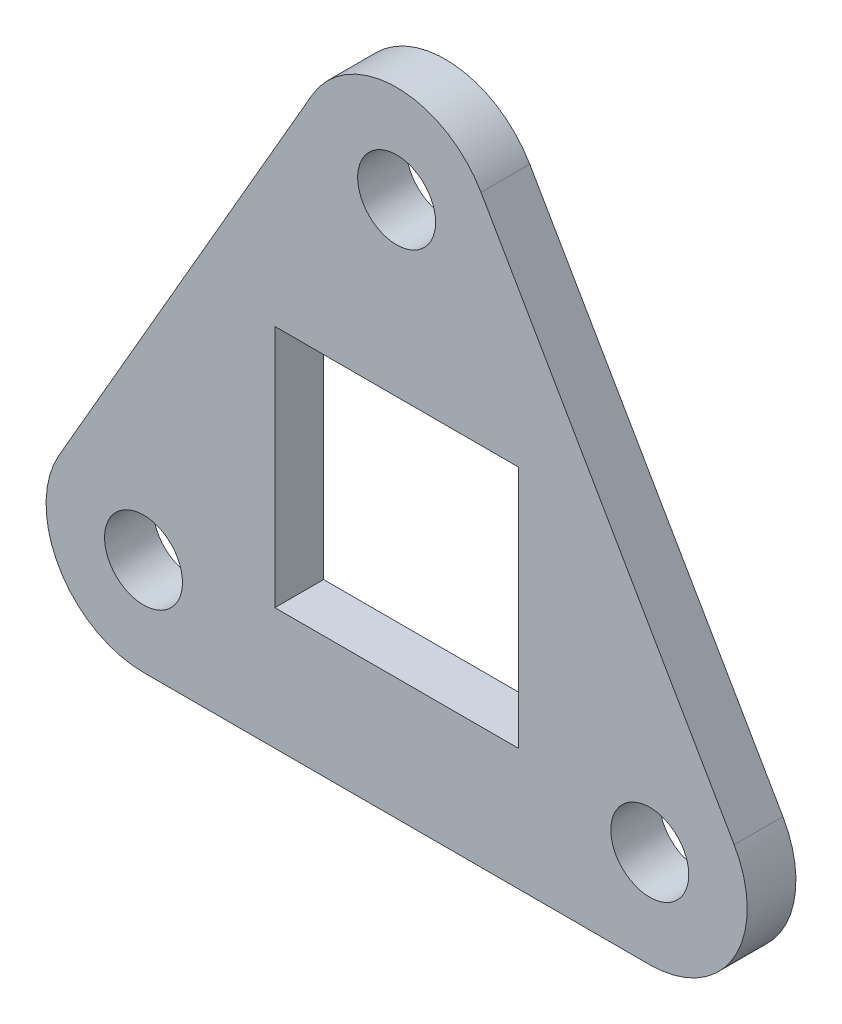
ISO-10303-21;
HEADER;
FILE_DESCRIPTION(('STEP AP214'),'2;1');
FILE_NAME('part.step','',(''),(''),'','','');
FILE_SCHEMA(('AUTOMOTIVE_DESIGN { 1 0 10303 214 1 1 1 1 }'));
ENDSEC;
DATA;
#1=APPLICATION_CONTEXT('core data for automotive mechanical design processes');
#2=APPLICATION_PROTOCOL_DEFINITION('international standard','automotive_design',2000,#1);
#3=PRODUCT_CONTEXT('',#1,'mechanical');
#4=PRODUCT('Part','Part','',(#3));
#5=PRODUCT_RELATED_PRODUCT_CATEGORY('part','',(#4));
#6=PRODUCT_DEFINITION_FORMATION('','',#4);
#7=PRODUCT_DEFINITION_CONTEXT('part definition',#1,'design');
#8=PRODUCT_DEFINITION('design','',#6,#7);
#9=PRODUCT_DEFINITION_SHAPE('','',#8);
#10=(LENGTH_UNIT() NAMED_UNIT(*) SI_UNIT(.MILLI.,.METRE.));
#11=(NAMED_UNIT(*) PLANE_ANGLE_UNIT() SI_UNIT($,.RADIAN.));
#12=(NAMED_UNIT(*) SI_UNIT($,.STERADIAN.) SOLID_ANGLE_UNIT());
#13=UNCERTAINTY_MEASURE_WITH_UNIT(LENGTH_MEASURE(1.E-05),#10,'distance_accuracy_value','');
#14=(GEOMETRIC_REPRESENTATION_CONTEXT(3) GLOBAL_UNCERTAINTY_ASSIGNED_CONTEXT((#13)) GLOBAL_UNIT_ASSIGNED_CONTEXT((#10,
#11,#12)) REPRESENTATION_CONTEXT('',''));
#15=CARTESIAN_POINT('',(0.,0.,0.));
#16=DIRECTION('',(0.,0.,1.));
#17=DIRECTION('',(1.,0.,0.));
#18=AXIS2_PLACEMENT_3D('',#15,#16,#17);
#19=CARTESIAN_POINT('',(0.,12.,2.));
#20=DIRECTION('',(0.,0.,-1.));
#21=DIRECTION('',(-1.,0.,0.));
#22=AXIS2_PLACEMENT_3D('',#19,#20,#21);
#23=PLANE('',#22);
#24=CARTESIAN_POINT('',(0.,12.,2.));
#25=DIRECTION('',(0.,0.,1.));
#26=DIRECTION('',(-1.,0.,0.));
#27=AXIS2_PLACEMENT_3D('',#24,#25,#26);
#28=CIRCLE('',#27,4.);
#29=CARTESIAN_POINT('',(3.46410161513776,14.,2.));
#30=VERTEX_POINT('',#29);
#31=CARTESIAN_POINT('',(-3.46410161513774,14.,2.));
#32=VERTEX_POINT('',#31);
#33=EDGE_CURVE('E149',#30,#32,#28,.T.);
#34=ORIENTED_EDGE('',*,*,#33,.T.);
#35=DIRECTION('',(-0.500000000000004,-0.866025403784436,0.));
#36=VECTOR('',#35,1.);
#37=CARTESIAN_POINT('',(-13.8564064605511,-3.99999999999989,2.));
#38=LINE('',#37,#36);
#39=CARTESIAN_POINT('',(-13.8564064605511,-3.99999999999987,2.));
#40=VERTEX_POINT('',#39);
#41=EDGE_CURVE('E152',#32,#40,#38,.T.);
#42=ORIENTED_EDGE('',*,*,#41,.T.);
#43=CARTESIAN_POINT('',(-10.3923048454133,-5.9999999999999,2.));
#44=DIRECTION('',(0.,0.,1.));
#45=DIRECTION('',(1.,0.,0.));
#46=AXIS2_PLACEMENT_3D('',#43,#44,#45);
#47=CIRCLE('',#46,4.00000000000004);
#48=CARTESIAN_POINT('',(-10.3923048454133,-9.99999999999999,2.));
#49=VERTEX_POINT('',#48);
#50=EDGE_CURVE('E155',#40,#49,#47,.T.);
#51=ORIENTED_EDGE('',*,*,#50,.T.);
#52=DIRECTION('',(1.,0.,0.));
#53=VECTOR('',#52,1.);
#54=CARTESIAN_POINT('',(-10.3923048454133,-9.99999999999999,2.));
#55=LINE('',#54,#53);
#56=CARTESIAN_POINT('',(10.3923048454132,-10.,2.));
#57=VERTEX_POINT('',#56);
#58=EDGE_CURVE('E157',#49,#57,#55,.T.);
#59=ORIENTED_EDGE('',*,*,#58,.T.);
#60=CARTESIAN_POINT('',(10.3923048454132,-6.00000000000005,2.));
#61=DIRECTION('',(0.,0.,1.));
#62=DIRECTION('',(1.,0.,0.));
#63=AXIS2_PLACEMENT_3D('',#60,#61,#62);
#64=CIRCLE('',#63,3.99999999999998);
#65=CARTESIAN_POINT('',(13.856406460551,-4.00000000000006,2.));
#66=VERTEX_POINT('',#65);
#67=EDGE_CURVE('E159',#57,#66,#64,.T.);
#68=ORIENTED_EDGE('',*,*,#67,.T.);
#69=DIRECTION('',(-0.499999999999998,0.86602540378444,0.));
#70=VECTOR('',#69,1.);
#71=CARTESIAN_POINT('',(3.46410161513776,14.,2.));
#72=LINE('',#71,#70);
#73=EDGE_CURVE('E161',#66,#30,#72,.T.);
#74=ORIENTED_EDGE('',*,*,#73,.T.);
#75=EDGE_LOOP('',(#34,#42,#51,#59,#68,#74));
#76=FACE_BOUND('',#75,.T.);
#77=DIRECTION('',(0.,-1.,0.));
#78=VECTOR('',#77,1.);
#79=CARTESIAN_POINT('',(-5.,-5.,2.));
#80=LINE('',#79,#78);
#81=CARTESIAN_POINT('',(-5.,5.,2.));
#82=VERTEX_POINT('',#81);
#83=CARTESIAN_POINT('',(-5.,-5.,2.));
#84=VERTEX_POINT('',#83);
#85=EDGE_CURVE('E110',#82,#84,#80,.T.);
#86=ORIENTED_EDGE('',*,*,#85,.F.);
#87=DIRECTION('',(-1.,0.,0.));
#88=VECTOR('',#87,1.);
#89=CARTESIAN_POINT('',(5.,5.,2.));
#90=LINE('',#89,#88);
#91=CARTESIAN_POINT('',(5.,5.,2.));
#92=VERTEX_POINT('',#91);
#93=EDGE_CURVE('E133',#92,#82,#90,.T.);
#94=ORIENTED_EDGE('',*,*,#93,.F.);
#95=DIRECTION('',(0.,1.,0.));
#96=VECTOR('',#95,1.);
#97=CARTESIAN_POINT('',(5.,-5.,2.));
#98=LINE('',#97,#96);
#99=CARTESIAN_POINT('',(5.,-5.,2.));
#100=VERTEX_POINT('',#99);
#101=EDGE_CURVE('E131',#100,#92,#98,.T.);
#102=ORIENTED_EDGE('',*,*,#101,.F.);
#103=DIRECTION('',(1.,0.,0.));
#104=VECTOR('',#103,1.);
#105=CARTESIAN_POINT('',(5.,-5.,2.));
#106=LINE('',#105,#104);
#107=EDGE_CURVE('E118',#84,#100,#106,.T.);
#108=ORIENTED_EDGE('',*,*,#107,.F.);
#109=EDGE_LOOP('',(#86,#94,#102,#108));
#110=FACE_BOUND('',#109,.T.);
#111=CARTESIAN_POINT('',(0.,12.,2.));
#112=DIRECTION('',(0.,0.,1.));
#113=DIRECTION('',(1.,0.,0.));
#114=AXIS2_PLACEMENT_3D('',#111,#112,#113);
#115=CIRCLE('',#114,1.6);
#116=CARTESIAN_POINT('',(1.6,12.,2.));
#117=VERTEX_POINT('',#116);
#118=EDGE_CURVE('E139',#117,#117,#115,.T.);
#119=ORIENTED_EDGE('',*,*,#118,.F.);
#120=EDGE_LOOP('',(#119));
#121=FACE_BOUND('',#120,.T.);
#122=CARTESIAN_POINT('',(10.3923048454132,-6.00000000000005,2.));
#123=DIRECTION('',(0.,0.,1.));
#124=DIRECTION('',(1.,0.,0.));
#125=AXIS2_PLACEMENT_3D('',#122,#123,#124);
#126=CIRCLE('',#125,1.6);
#127=CARTESIAN_POINT('',(11.9923048454132,-6.00000000000005,2.));
#128=VERTEX_POINT('',#127);
#129=EDGE_CURVE('E267',#128,#128,#126,.T.);
#130=ORIENTED_EDGE('',*,*,#129,.F.);
#131=EDGE_LOOP('',(#130));
#132=FACE_BOUND('',#131,.T.);
#133=CARTESIAN_POINT('',(-10.3923048454133,-5.9999999999999,2.));
#134=DIRECTION('',(0.,0.,1.));
#135=DIRECTION('',(1.,0.,0.));
#136=AXIS2_PLACEMENT_3D('',#133,#134,#135);
#137=CIRCLE('',#136,1.6);
#138=CARTESIAN_POINT('',(-8.79230484541331,-5.9999999999999,2.));
#139=VERTEX_POINT('',#138);
#140=EDGE_CURVE('E258',#139,#139,#137,.T.);
#141=ORIENTED_EDGE('',*,*,#140,.F.);
#142=EDGE_LOOP('',(#141));
#143=FACE_BOUND('',#142,.T.);
#144=ADVANCED_FACE('F33',(#76,#110,#121,#132,#143),#23,.F.);
#145=CARTESIAN_POINT('',(0.,12.,0.));
#146=DIRECTION('',(0.,0.,-1.));
#147=DIRECTION('',(-1.,0.,0.));
#148=AXIS2_PLACEMENT_3D('',#145,#146,#147);
#149=PLANE('',#148);
#150=CARTESIAN_POINT('',(10.3923048454132,-6.00000000000005,0.));
#151=DIRECTION('',(0.,0.,1.));
#152=DIRECTION('',(1.,0.,0.));
#153=AXIS2_PLACEMENT_3D('',#150,#151,#152);
#154=CIRCLE('',#153,1.6);
#155=CARTESIAN_POINT('',(11.9923048454132,-6.00000000000005,0.));
#156=VERTEX_POINT('',#155);
#157=EDGE_CURVE('E264',#156,#156,#154,.T.);
#158=ORIENTED_EDGE('',*,*,#157,.T.);
#159=EDGE_LOOP('',(#158));
#160=FACE_BOUND('',#159,.T.);
#161=DIRECTION('',(-1.,0.,0.));
#162=VECTOR('',#161,1.);
#163=CARTESIAN_POINT('',(5.,5.,0.));
#164=LINE('',#163,#162);
#165=CARTESIAN_POINT('',(5.,5.,0.));
#166=VERTEX_POINT('',#165);
#167=CARTESIAN_POINT('',(-5.,5.,0.));
#168=VERTEX_POINT('',#167);
#169=EDGE_CURVE('E119',#166,#168,#164,.T.);
#170=ORIENTED_EDGE('',*,*,#169,.T.);
#171=DIRECTION('',(0.,-1.,0.));
#172=VECTOR('',#171,1.);
#173=CARTESIAN_POINT('',(-5.,-5.,0.));
#174=LINE('',#173,#172);
#175=CARTESIAN_POINT('',(-5.,-5.,0.));
#176=VERTEX_POINT('',#175);
#177=EDGE_CURVE('E56',#168,#176,#174,.T.);
#178=ORIENTED_EDGE('',*,*,#177,.T.);
#179=DIRECTION('',(1.,0.,0.));
#180=VECTOR('',#179,1.);
#181=CARTESIAN_POINT('',(5.,-5.,0.));
#182=LINE('',#181,#180);
#183=CARTESIAN_POINT('',(5.,-5.,0.));
#184=VERTEX_POINT('',#183);
#185=EDGE_CURVE('E125',#176,#184,#182,.T.);
#186=ORIENTED_EDGE('',*,*,#185,.T.);
#187=DIRECTION('',(0.,1.,0.));
#188=VECTOR('',#187,1.);
#189=CARTESIAN_POINT('',(5.,-5.,0.));
#190=LINE('',#189,#188);
#191=EDGE_CURVE('E141',#184,#166,#190,.T.);
#192=ORIENTED_EDGE('',*,*,#191,.T.);
#193=EDGE_LOOP('',(#170,#178,#186,#192));
#194=FACE_BOUND('',#193,.T.);
#195=CARTESIAN_POINT('',(0.,12.,0.));
#196=DIRECTION('',(0.,0.,1.));
#197=DIRECTION('',(-1.,0.,0.));
#198=AXIS2_PLACEMENT_3D('',#195,#196,#197);
#199=CIRCLE('',#198,4.);
#200=CARTESIAN_POINT('',(3.46410161513776,14.,0.));
#201=VERTEX_POINT('',#200);
#202=CARTESIAN_POINT('',(-3.46410161513774,14.,0.));
#203=VERTEX_POINT('',#202);
#204=EDGE_CURVE('E126',#201,#203,#199,.T.);
#205=ORIENTED_EDGE('',*,*,#204,.F.);
#206=DIRECTION('',(-0.499999999999998,0.86602540378444,0.));
#207=VECTOR('',#206,1.);
#208=CARTESIAN_POINT('',(3.46410161513776,14.,0.));
#209=LINE('',#208,#207);
#210=CARTESIAN_POINT('',(13.856406460551,-4.00000000000006,0.));
#211=VERTEX_POINT('',#210);
#212=EDGE_CURVE('E153',#211,#201,#209,.T.);
#213=ORIENTED_EDGE('',*,*,#212,.F.);
#214=CARTESIAN_POINT('',(10.3923048454132,-6.00000000000005,0.));
#215=DIRECTION('',(0.,0.,1.));
#216=DIRECTION('',(1.,0.,0.));
#217=AXIS2_PLACEMENT_3D('',#214,#215,#216);
#218=CIRCLE('',#217,3.99999999999998);
#219=CARTESIAN_POINT('',(10.3923048454132,-10.,0.));
#220=VERTEX_POINT('',#219);
#221=EDGE_CURVE('E172',#220,#211,#218,.T.);
#222=ORIENTED_EDGE('',*,*,#221,.F.);
#223=DIRECTION('',(1.,0.,0.));
#224=VECTOR('',#223,1.);
#225=CARTESIAN_POINT('',(-10.3923048454133,-9.99999999999999,0.));
#226=LINE('',#225,#224);
#227=CARTESIAN_POINT('',(-10.3923048454133,-9.99999999999999,0.));
#228=VERTEX_POINT('',#227);
#229=EDGE_CURVE('E170',#228,#220,#226,.T.);
#230=ORIENTED_EDGE('',*,*,#229,.F.);
#231=CARTESIAN_POINT('',(-10.3923048454133,-5.9999999999999,0.));
#232=DIRECTION('',(0.,0.,1.));
#233=DIRECTION('',(1.,0.,0.));
#234=AXIS2_PLACEMENT_3D('',#231,#232,#233);
#235=CIRCLE('',#234,4.00000000000004);
#236=CARTESIAN_POINT('',(-13.8564064605511,-3.99999999999987,0.));
#237=VERTEX_POINT('',#236);
#238=EDGE_CURVE('E168',#237,#228,#235,.T.);
#239=ORIENTED_EDGE('',*,*,#238,.F.);
#240=DIRECTION('',(-0.500000000000004,-0.866025403784436,0.));
#241=VECTOR('',#240,1.);
#242=CARTESIAN_POINT('',(-13.8564064605511,-3.99999999999989,0.));
#243=LINE('',#242,#241);
#244=EDGE_CURVE('E166',#203,#237,#243,.T.);
#245=ORIENTED_EDGE('',*,*,#244,.F.);
#246=EDGE_LOOP('',(#205,#213,#222,#230,#239,#245));
#247=FACE_BOUND('',#246,.T.);
#248=CARTESIAN_POINT('',(0.,12.,0.));
#249=DIRECTION('',(0.,0.,1.));
#250=DIRECTION('',(1.,0.,0.));
#251=AXIS2_PLACEMENT_3D('',#248,#249,#250);
#252=CIRCLE('',#251,1.6);
#253=CARTESIAN_POINT('',(1.6,12.,0.));
#254=VERTEX_POINT('',#253);
#255=EDGE_CURVE('E270',#254,#254,#252,.T.);
#256=ORIENTED_EDGE('',*,*,#255,.T.);
#257=EDGE_LOOP('',(#256));
#258=FACE_BOUND('',#257,.T.);
#259=CARTESIAN_POINT('',(-10.3923048454133,-5.9999999999999,0.));
#260=DIRECTION('',(0.,0.,1.));
#261=DIRECTION('',(1.,0.,0.));
#262=AXIS2_PLACEMENT_3D('',#259,#260,#261);
#263=CIRCLE('',#262,1.6);
#264=CARTESIAN_POINT('',(-8.79230484541331,-5.9999999999999,0.));
#265=VERTEX_POINT('',#264);
#266=EDGE_CURVE('E261',#265,#265,#263,.T.);
#267=ORIENTED_EDGE('',*,*,#266,.T.);
#268=EDGE_LOOP('',(#267));
#269=FACE_BOUND('',#268,.T.);
#270=ADVANCED_FACE('F196',(#160,#194,#247,#258,#269),#149,.T.);
#271=CARTESIAN_POINT('',(0.,12.,2.));
#272=DIRECTION('',(0.,0.,-1.));
#273=DIRECTION('',(-1.,0.,0.));
#274=AXIS2_PLACEMENT_3D('',#271,#272,#273);
#275=CYLINDRICAL_SURFACE('',#274,4.);
#276=ORIENTED_EDGE('',*,*,#204,.T.);
#277=DIRECTION('',(0.,0.,-1.));
#278=VECTOR('',#277,1.);
#279=CARTESIAN_POINT('',(-3.46410161513774,14.,2.));
#280=LINE('',#279,#278);
#281=EDGE_CURVE('E11',#32,#203,#280,.T.);
#282=ORIENTED_EDGE('',*,*,#281,.F.);
#283=ORIENTED_EDGE('',*,*,#33,.F.);
#284=DIRECTION('',(0.,0.,-1.));
#285=VECTOR('',#284,1.);
#286=CARTESIAN_POINT('',(3.46410161513776,14.,2.));
#287=LINE('',#286,#285);
#288=EDGE_CURVE('E163',#30,#201,#287,.T.);
#289=ORIENTED_EDGE('',*,*,#288,.T.);
#290=EDGE_LOOP('',(#276,#282,#283,#289));
#291=FACE_BOUND('',#290,.T.);
#292=ADVANCED_FACE('F35',(#291),#275,.T.);
#293=CARTESIAN_POINT('',(-13.8564064605511,-3.99999999999989,2.));
#294=DIRECTION('',(0.866025403784436,-0.500000000000004,0.));
#295=DIRECTION('',(0.500000000000004,0.866025403784437,0.));
#296=AXIS2_PLACEMENT_3D('',#293,#294,#295);
#297=PLANE('',#296);
#298=ORIENTED_EDGE('',*,*,#244,.T.);
#299=DIRECTION('',(0.,0.,-1.));
#300=VECTOR('',#299,1.);
#301=CARTESIAN_POINT('',(-13.8564064605511,-3.99999999999987,2.));
#302=LINE('',#301,#300);
#303=EDGE_CURVE('E41',#40,#237,#302,.T.);
#304=ORIENTED_EDGE('',*,*,#303,.F.);
#305=ORIENTED_EDGE('',*,*,#41,.F.);
#306=ORIENTED_EDGE('',*,*,#281,.T.);
#307=EDGE_LOOP('',(#298,#304,#305,#306));
#308=FACE_BOUND('',#307,.T.);
#309=ADVANCED_FACE('F213',(#308),#297,.F.);
#310=CARTESIAN_POINT('',(-10.3923048454133,-5.9999999999999,2.));
#311=DIRECTION('',(0.,0.,-1.));
#312=DIRECTION('',(-1.,0.,0.));
#313=AXIS2_PLACEMENT_3D('',#310,#311,#312);
#314=CYLINDRICAL_SURFACE('',#313,4.00000000000004);
#315=ORIENTED_EDGE('',*,*,#238,.T.);
#316=DIRECTION('',(0.,0.,-1.));
#317=VECTOR('',#316,1.);
#318=CARTESIAN_POINT('',(-10.3923048454133,-9.99999999999999,2.));
#319=LINE('',#318,#317);
#320=EDGE_CURVE('E183',#49,#228,#319,.T.);
#321=ORIENTED_EDGE('',*,*,#320,.F.);
#322=ORIENTED_EDGE('',*,*,#50,.F.);
#323=ORIENTED_EDGE('',*,*,#303,.T.);
#324=EDGE_LOOP('',(#315,#321,#322,#323));
#325=FACE_BOUND('',#324,.T.);
#326=ADVANCED_FACE('F190',(#325),#314,.T.);
#327=CARTESIAN_POINT('',(-10.3923048454133,-9.99999999999999,2.));
#328=DIRECTION('',(0.,1.,0.));
#329=DIRECTION('',(-1.,0.,0.));
#330=AXIS2_PLACEMENT_3D('',#327,#328,#329);
#331=PLANE('',#330);
#332=ORIENTED_EDGE('',*,*,#229,.T.);
#333=DIRECTION('',(0.,0.,-1.));
#334=VECTOR('',#333,1.);
#335=CARTESIAN_POINT('',(10.3923048454132,-10.,2.));
#336=LINE('',#335,#334);
#337=EDGE_CURVE('E180',#57,#220,#336,.T.);
#338=ORIENTED_EDGE('',*,*,#337,.F.);
#339=ORIENTED_EDGE('',*,*,#58,.F.);
#340=ORIENTED_EDGE('',*,*,#320,.T.);
#341=EDGE_LOOP('',(#332,#338,#339,#340));
#342=FACE_BOUND('',#341,.T.);
#343=ADVANCED_FACE('F202',(#342),#331,.F.);
#344=CARTESIAN_POINT('',(10.3923048454132,-6.00000000000005,2.));
#345=DIRECTION('',(0.,0.,-1.));
#346=DIRECTION('',(-1.,0.,0.));
#347=AXIS2_PLACEMENT_3D('',#344,#345,#346);
#348=CYLINDRICAL_SURFACE('',#347,3.99999999999998);
#349=ORIENTED_EDGE('',*,*,#221,.T.);
#350=DIRECTION('',(0.,0.,-1.));
#351=VECTOR('',#350,1.);
#352=CARTESIAN_POINT('',(13.856406460551,-4.00000000000006,2.));
#353=LINE('',#352,#351);
#354=EDGE_CURVE('E177',#66,#211,#353,.T.);
#355=ORIENTED_EDGE('',*,*,#354,.F.);
#356=ORIENTED_EDGE('',*,*,#67,.F.);
#357=ORIENTED_EDGE('',*,*,#337,.T.);
#358=EDGE_LOOP('',(#349,#355,#356,#357));
#359=FACE_BOUND('',#358,.T.);
#360=ADVANCED_FACE('F206',(#359),#348,.T.);
#361=CARTESIAN_POINT('',(3.46410161513776,14.,2.));
#362=DIRECTION('',(-0.86602540378444,-0.499999999999998,0.));
#363=DIRECTION('',(0.499999999999998,-0.86602540378444,0.));
#364=AXIS2_PLACEMENT_3D('',#361,#362,#363);
#365=PLANE('',#364);
#366=ORIENTED_EDGE('',*,*,#212,.T.);
#367=ORIENTED_EDGE('',*,*,#288,.F.);
#368=ORIENTED_EDGE('',*,*,#73,.F.);
#369=ORIENTED_EDGE('',*,*,#354,.T.);
#370=EDGE_LOOP('',(#366,#367,#368,#369));
#371=FACE_BOUND('',#370,.T.);
#372=ADVANCED_FACE('F216',(#371),#365,.F.);
#373=CARTESIAN_POINT('',(-5.,-5.,2.));
#374=DIRECTION('',(1.,0.,0.));
#375=DIRECTION('',(0.,0.,-1.));
#376=AXIS2_PLACEMENT_3D('',#373,#374,#375);
#377=PLANE('',#376);
#378=ORIENTED_EDGE('',*,*,#177,.F.);
#379=DIRECTION('',(0.,0.,-1.));
#380=VECTOR('',#379,1.);
#381=CARTESIAN_POINT('',(-5.,5.,2.));
#382=LINE('',#381,#380);
#383=EDGE_CURVE('E114',#82,#168,#382,.T.);
#384=ORIENTED_EDGE('',*,*,#383,.F.);
#385=ORIENTED_EDGE('',*,*,#85,.T.);
#386=DIRECTION('',(0.,0.,-1.));
#387=VECTOR('',#386,1.);
#388=CARTESIAN_POINT('',(-5.,-5.,2.));
#389=LINE('',#388,#387);
#390=EDGE_CURVE('E113',#84,#176,#389,.T.);
#391=ORIENTED_EDGE('',*,*,#390,.T.);
#392=EDGE_LOOP('',(#378,#384,#385,#391));
#393=FACE_BOUND('',#392,.T.);
#394=ADVANCED_FACE('F112',(#393),#377,.T.);
#395=CARTESIAN_POINT('',(5.,-5.,2.));
#396=DIRECTION('',(0.,1.,0.));
#397=DIRECTION('',(-1.,0.,0.));
#398=AXIS2_PLACEMENT_3D('',#395,#396,#397);
#399=PLANE('',#398);
#400=ORIENTED_EDGE('',*,*,#185,.F.);
#401=ORIENTED_EDGE('',*,*,#390,.F.);
#402=ORIENTED_EDGE('',*,*,#107,.T.);
#403=DIRECTION('',(0.,0.,-1.));
#404=VECTOR('',#403,1.);
#405=CARTESIAN_POINT('',(5.,-5.,2.));
#406=LINE('',#405,#404);
#407=EDGE_CURVE('E127',#100,#184,#406,.T.);
#408=ORIENTED_EDGE('',*,*,#407,.T.);
#409=EDGE_LOOP('',(#400,#401,#402,#408));
#410=FACE_BOUND('',#409,.T.);
#411=ADVANCED_FACE('F122',(#410),#399,.T.);
#412=CARTESIAN_POINT('',(5.,-5.,2.));
#413=DIRECTION('',(-1.,0.,0.));
#414=DIRECTION('',(0.,0.,1.));
#415=AXIS2_PLACEMENT_3D('',#412,#413,#414);
#416=PLANE('',#415);
#417=ORIENTED_EDGE('',*,*,#191,.F.);
#418=ORIENTED_EDGE('',*,*,#407,.F.);
#419=ORIENTED_EDGE('',*,*,#101,.T.);
#420=DIRECTION('',(0.,0.,-1.));
#421=VECTOR('',#420,1.);
#422=CARTESIAN_POINT('',(5.,5.,2.));
#423=LINE('',#422,#421);
#424=EDGE_CURVE('E48',#92,#166,#423,.T.);
#425=ORIENTED_EDGE('',*,*,#424,.T.);
#426=EDGE_LOOP('',(#417,#418,#419,#425));
#427=FACE_BOUND('',#426,.T.);
#428=ADVANCED_FACE('F235',(#427),#416,.T.);
#429=CARTESIAN_POINT('',(5.,5.,2.));
#430=DIRECTION('',(0.,-1.,0.));
#431=DIRECTION('',(1.,0.,0.));
#432=AXIS2_PLACEMENT_3D('',#429,#430,#431);
#433=PLANE('',#432);
#434=ORIENTED_EDGE('',*,*,#169,.F.);
#435=ORIENTED_EDGE('',*,*,#424,.F.);
#436=ORIENTED_EDGE('',*,*,#93,.T.);
#437=ORIENTED_EDGE('',*,*,#383,.T.);
#438=EDGE_LOOP('',(#434,#435,#436,#437));
#439=FACE_BOUND('',#438,.T.);
#440=ADVANCED_FACE('F238',(#439),#433,.T.);
#441=CARTESIAN_POINT('',(0.,12.,2.));
#442=DIRECTION('',(0.,0.,-1.));
#443=DIRECTION('',(-1.,0.,0.));
#444=AXIS2_PLACEMENT_3D('',#441,#442,#443);
#445=CYLINDRICAL_SURFACE('',#444,1.6);
#446=ORIENTED_EDGE('',*,*,#118,.T.);
#447=EDGE_LOOP('',(#446));
#448=FACE_BOUND('',#447,.T.);
#449=ORIENTED_EDGE('',*,*,#255,.F.);
#450=EDGE_LOOP('',(#449));
#451=FACE_BOUND('',#450,.T.);
#452=ADVANCED_FACE('F242',(#448,#451),#445,.F.);
#453=CARTESIAN_POINT('',(10.3923048454132,-6.00000000000005,2.));
#454=DIRECTION('',(0.,0.,-1.));
#455=DIRECTION('',(-1.,0.,0.));
#456=AXIS2_PLACEMENT_3D('',#453,#454,#455);
#457=CYLINDRICAL_SURFACE('',#456,1.6);
#458=ORIENTED_EDGE('',*,*,#129,.T.);
#459=EDGE_LOOP('',(#458));
#460=FACE_BOUND('',#459,.T.);
#461=ORIENTED_EDGE('',*,*,#157,.F.);
#462=EDGE_LOOP('',(#461));
#463=FACE_BOUND('',#462,.T.);
#464=ADVANCED_FACE('F245',(#460,#463),#457,.F.);
#465=CARTESIAN_POINT('',(-10.3923048454133,-5.9999999999999,2.));
#466=DIRECTION('',(0.,0.,-1.));
#467=DIRECTION('',(-1.,0.,0.));
#468=AXIS2_PLACEMENT_3D('',#465,#466,#467);
#469=CYLINDRICAL_SURFACE('',#468,1.6);
#470=ORIENTED_EDGE('',*,*,#140,.T.);
#471=EDGE_LOOP('',(#470));
#472=FACE_BOUND('',#471,.T.);
#473=ORIENTED_EDGE('',*,*,#266,.F.);
#474=EDGE_LOOP('',(#473));
#475=FACE_BOUND('',#474,.T.);
#476=ADVANCED_FACE('F249',(#472,#475),#469,.F.);
#477=CLOSED_SHELL('',(#144,#270,#292,#309,#326,#343,#360,#372,#394,#411,#428,#440,#452,#464,#476));
#478=MANIFOLD_SOLID_BREP('B2',#477);
#479=ADVANCED_BREP_SHAPE_REPRESENTATION('',(#18,#478),#14);
#480=SHAPE_DEFINITION_REPRESENTATION(#9,#479);
ENDSEC;
END-ISO-10303-21;
